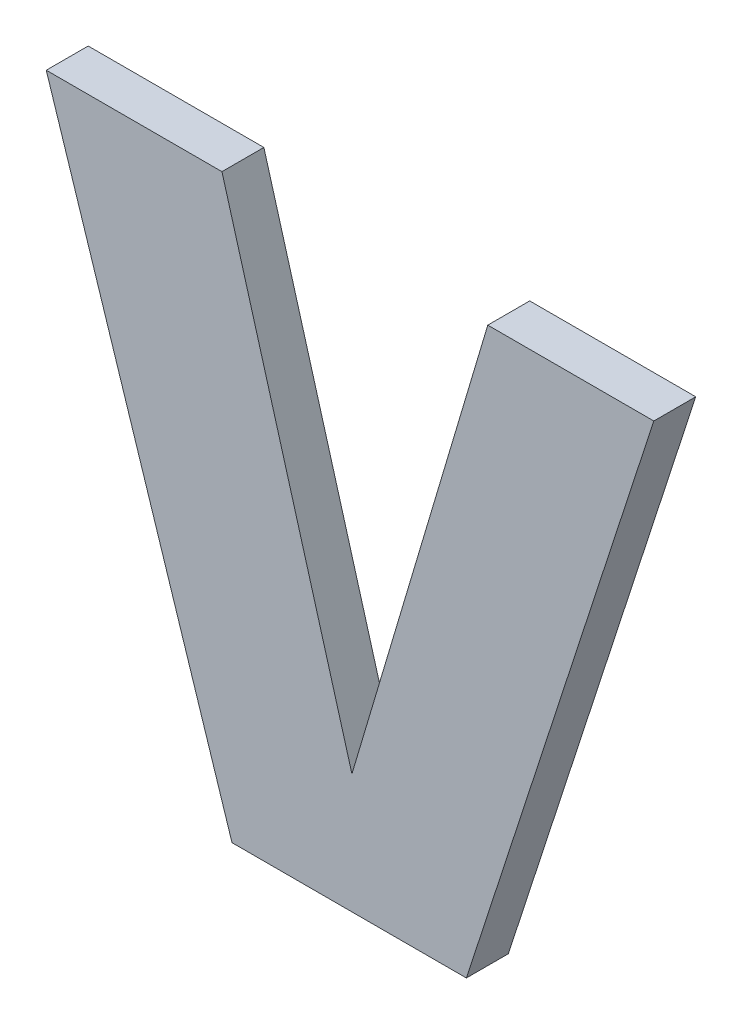
ISO-10303-21;
HEADER;
FILE_DESCRIPTION(('STEP AP214'),'2;1');
FILE_NAME('part.step','',(''),(''),'','','');
FILE_SCHEMA(('AUTOMOTIVE_DESIGN { 1 0 10303 214 1 1 1 1 }'));
ENDSEC;
DATA;
#1=APPLICATION_CONTEXT('core data for automotive mechanical design processes');
#2=APPLICATION_PROTOCOL_DEFINITION('international standard','automotive_design',2000,#1);
#3=PRODUCT_CONTEXT('',#1,'mechanical');
#4=PRODUCT('Part','Part','',(#3));
#5=PRODUCT_RELATED_PRODUCT_CATEGORY('part','',(#4));
#6=PRODUCT_DEFINITION_FORMATION('','',#4);
#7=PRODUCT_DEFINITION_CONTEXT('part definition',#1,'design');
#8=PRODUCT_DEFINITION('design','',#6,#7);
#9=PRODUCT_DEFINITION_SHAPE('','',#8);
#10=(LENGTH_UNIT() NAMED_UNIT(*) SI_UNIT(.MILLI.,.METRE.));
#11=(NAMED_UNIT(*) PLANE_ANGLE_UNIT() SI_UNIT($,.RADIAN.));
#12=(NAMED_UNIT(*) SI_UNIT($,.STERADIAN.) SOLID_ANGLE_UNIT());
#13=UNCERTAINTY_MEASURE_WITH_UNIT(LENGTH_MEASURE(1.E-05),#10,'distance_accuracy_value','');
#14=(GEOMETRIC_REPRESENTATION_CONTEXT(3) GLOBAL_UNCERTAINTY_ASSIGNED_CONTEXT((#13)) GLOBAL_UNIT_ASSIGNED_CONTEXT((#10,
#11,#12)) REPRESENTATION_CONTEXT('',''));
#15=CARTESIAN_POINT('',(0.,0.,0.));
#16=DIRECTION('',(0.,0.,1.));
#17=DIRECTION('',(1.,0.,0.));
#18=AXIS2_PLACEMENT_3D('',#15,#16,#17);
#19=CARTESIAN_POINT('',(0.,0.,0.1));
#20=DIRECTION('',(0.,0.,1.));
#21=DIRECTION('',(1.,0.,0.));
#22=AXIS2_PLACEMENT_3D('',#19,#20,#21);
#23=PLANE('',#22);
#24=DIRECTION('',(-0.273787820309391,0.961790117151467,0.));
#25=VECTOR('',#24,1.);
#26=CARTESIAN_POINT('',(-1.583,-2.527,0.1));
#27=LINE('',#26,#25);
#28=CARTESIAN_POINT('',(-1.89299999999999,-1.438,0.1));
#29=VERTEX_POINT('',#28);
#30=CARTESIAN_POINT('',(-1.58300000000001,-2.527,0.1));
#31=VERTEX_POINT('',#30);
#32=EDGE_CURVE('E88',#29,#31,#27,.F.);
#33=ORIENTED_EDGE('',*,*,#32,.F.);
#34=DIRECTION('',(1.,0.,0.));
#35=VECTOR('',#34,1.);
#36=CARTESIAN_POINT('',(-1.893,-1.438,0.1));
#37=LINE('',#36,#35);
#38=CARTESIAN_POINT('',(-2.312,-1.438,0.1));
#39=VERTEX_POINT('',#38);
#40=EDGE_CURVE('E20',#39,#29,#37,.T.);
#41=ORIENTED_EDGE('',*,*,#40,.F.);
#42=DIRECTION('',(0.306861105029002,-0.951754307697307,0.));
#43=VECTOR('',#42,1.);
#44=CARTESIAN_POINT('',(-2.312,-1.438,0.1));
#45=LINE('',#44,#43);
#46=CARTESIAN_POINT('',(-1.86900000000001,-2.812,0.1));
#47=VERTEX_POINT('',#46);
#48=EDGE_CURVE('E77',#47,#39,#45,.F.);
#49=ORIENTED_EDGE('',*,*,#48,.F.);
#50=DIRECTION('',(1.,0.,0.));
#51=VECTOR('',#50,1.);
#52=CARTESIAN_POINT('',(-1.869,-2.812,0.1));
#53=LINE('',#52,#51);
#54=CARTESIAN_POINT('',(-1.31,-2.812,0.1));
#55=VERTEX_POINT('',#54);
#56=EDGE_CURVE('E72',#55,#47,#53,.F.);
#57=ORIENTED_EDGE('',*,*,#56,.F.);
#58=DIRECTION('',(0.309367749264704,0.950942477605713,0.));
#59=VECTOR('',#58,1.);
#60=CARTESIAN_POINT('',(-1.31,-2.812,0.1));
#61=LINE('',#60,#59);
#62=CARTESIAN_POINT('',(-0.863000000000012,-1.438,0.1));
#63=VERTEX_POINT('',#62);
#64=EDGE_CURVE('E99',#63,#55,#61,.F.);
#65=ORIENTED_EDGE('',*,*,#64,.F.);
#66=DIRECTION('',(1.,0.,0.));
#67=VECTOR('',#66,1.);
#68=CARTESIAN_POINT('',(-0.863,-1.438,0.1));
#69=LINE('',#68,#67);
#70=CARTESIAN_POINT('',(-1.259,-1.438,0.1));
#71=VERTEX_POINT('',#70);
#72=EDGE_CURVE('E103',#71,#63,#69,.T.);
#73=ORIENTED_EDGE('',*,*,#72,.F.);
#74=DIRECTION('',(-0.285166965619702,-0.958477856666106,0.));
#75=VECTOR('',#74,1.);
#76=CARTESIAN_POINT('',(-1.259,-1.438,0.1));
#77=LINE('',#76,#75);
#78=EDGE_CURVE('E107',#31,#71,#77,.F.);
#79=ORIENTED_EDGE('',*,*,#78,.F.);
#80=EDGE_LOOP('',(#33,#41,#49,#57,#65,#73,#79));
#81=FACE_BOUND('',#80,.T.);
#82=ADVANCED_FACE('F17',(#81),#23,.T.);
#83=CARTESIAN_POINT('',(-1.893,-1.438,0.));
#84=DIRECTION('',(0.,1.,0.));
#85=DIRECTION('',(0.,0.,1.));
#86=AXIS2_PLACEMENT_3D('',#83,#84,#85);
#87=PLANE('',#86);
#88=DIRECTION('',(0.,0.,1.));
#89=VECTOR('',#88,1.);
#90=CARTESIAN_POINT('',(-1.89299999999997,-1.43799999999999,0.));
#91=LINE('',#90,#89);
#92=CARTESIAN_POINT('',(-1.89299999999999,-1.438,0.));
#93=VERTEX_POINT('',#92);
#94=EDGE_CURVE('E111',#93,#29,#91,.T.);
#95=ORIENTED_EDGE('',*,*,#94,.F.);
#96=DIRECTION('',(1.,0.,0.));
#97=VECTOR('',#96,1.);
#98=CARTESIAN_POINT('',(0.,-1.438,0.));
#99=LINE('',#98,#97);
#100=CARTESIAN_POINT('',(-2.312,-1.438,0.));
#101=VERTEX_POINT('',#100);
#102=EDGE_CURVE('E94',#93,#101,#99,.F.);
#103=ORIENTED_EDGE('',*,*,#102,.T.);
#104=DIRECTION('',(0.,0.,1.));
#105=VECTOR('',#104,1.);
#106=CARTESIAN_POINT('',(-2.312,-1.438,0.));
#107=LINE('',#106,#105);
#108=EDGE_CURVE('E82',#39,#101,#107,.F.);
#109=ORIENTED_EDGE('',*,*,#108,.F.);
#110=ORIENTED_EDGE('',*,*,#40,.T.);
#111=EDGE_LOOP('',(#95,#103,#109,#110));
#112=FACE_BOUND('',#111,.T.);
#113=ADVANCED_FACE('F93',(#112),#87,.T.);
#114=CARTESIAN_POINT('',(-2.312,-1.438,0.));
#115=DIRECTION('',(-0.951754307697307,-0.306861105029002,0.));
#116=DIRECTION('',(0.306861105029002,-0.951754307697307,0.));
#117=AXIS2_PLACEMENT_3D('',#114,#115,#116);
#118=PLANE('',#117);
#119=ORIENTED_EDGE('',*,*,#108,.T.);
#120=DIRECTION('',(0.30686110502904,-0.951754307697294,0.));
#121=VECTOR('',#120,1.);
#122=CARTESIAN_POINT('',(-2.312,-1.438,0.));
#123=LINE('',#122,#121);
#124=CARTESIAN_POINT('',(-1.86900000000003,-2.81200000000001,0.));
#125=VERTEX_POINT('',#124);
#126=EDGE_CURVE('E116',#101,#125,#123,.T.);
#127=ORIENTED_EDGE('',*,*,#126,.T.);
#128=DIRECTION('',(0.,0.,-1.));
#129=VECTOR('',#128,1.);
#130=CARTESIAN_POINT('',(-1.869,-2.812,0.));
#131=LINE('',#130,#129);
#132=EDGE_CURVE('E84',#47,#125,#131,.T.);
#133=ORIENTED_EDGE('',*,*,#132,.F.);
#134=ORIENTED_EDGE('',*,*,#48,.T.);
#135=EDGE_LOOP('',(#119,#127,#133,#134));
#136=FACE_BOUND('',#135,.T.);
#137=ADVANCED_FACE('F79',(#136),#118,.T.);
#138=CARTESIAN_POINT('',(-1.869,-2.812,0.));
#139=DIRECTION('',(0.,-1.,0.));
#140=DIRECTION('',(0.,0.,-1.));
#141=AXIS2_PLACEMENT_3D('',#138,#139,#140);
#142=PLANE('',#141);
#143=ORIENTED_EDGE('',*,*,#132,.T.);
#144=DIRECTION('',(1.,0.,0.));
#145=VECTOR('',#144,1.);
#146=CARTESIAN_POINT('',(0.,-2.812,0.));
#147=LINE('',#146,#145);
#148=CARTESIAN_POINT('',(-1.31,-2.812,0.));
#149=VERTEX_POINT('',#148);
#150=EDGE_CURVE('E118',#125,#149,#147,.T.);
#151=ORIENTED_EDGE('',*,*,#150,.T.);
#152=DIRECTION('',(0.,0.,1.));
#153=VECTOR('',#152,1.);
#154=CARTESIAN_POINT('',(-1.31,-2.812,0.));
#155=LINE('',#154,#153);
#156=EDGE_CURVE('E101',#55,#149,#155,.F.);
#157=ORIENTED_EDGE('',*,*,#156,.F.);
#158=ORIENTED_EDGE('',*,*,#56,.T.);
#159=EDGE_LOOP('',(#143,#151,#157,#158));
#160=FACE_BOUND('',#159,.T.);
#161=ADVANCED_FACE('F144',(#160),#142,.T.);
#162=CARTESIAN_POINT('',(-1.31,-2.812,0.));
#163=DIRECTION('',(0.950942477605713,-0.309367749264704,0.));
#164=DIRECTION('',(0.309367749264704,0.950942477605713,0.));
#165=AXIS2_PLACEMENT_3D('',#162,#163,#164);
#166=PLANE('',#165);
#167=ORIENTED_EDGE('',*,*,#156,.T.);
#168=DIRECTION('',(0.309367749264737,0.950942477605702,0.));
#169=VECTOR('',#168,1.);
#170=CARTESIAN_POINT('',(-1.31,-2.812,0.));
#171=LINE('',#170,#169);
#172=CARTESIAN_POINT('',(-0.863000000000024,-1.43799999999999,0.));
#173=VERTEX_POINT('',#172);
#174=EDGE_CURVE('E121',#149,#173,#171,.T.);
#175=ORIENTED_EDGE('',*,*,#174,.T.);
#176=DIRECTION('',(0.,0.,1.));
#177=VECTOR('',#176,1.);
#178=CARTESIAN_POINT('',(-0.863,-1.438,0.));
#179=LINE('',#178,#177);
#180=EDGE_CURVE('E105',#63,#173,#179,.F.);
#181=ORIENTED_EDGE('',*,*,#180,.F.);
#182=ORIENTED_EDGE('',*,*,#64,.T.);
#183=EDGE_LOOP('',(#167,#175,#181,#182));
#184=FACE_BOUND('',#183,.T.);
#185=ADVANCED_FACE('F142',(#184),#166,.T.);
#186=CARTESIAN_POINT('',(-0.863,-1.438,0.));
#187=DIRECTION('',(0.,1.,0.));
#188=DIRECTION('',(0.,0.,1.));
#189=AXIS2_PLACEMENT_3D('',#186,#187,#188);
#190=PLANE('',#189);
#191=ORIENTED_EDGE('',*,*,#180,.T.);
#192=DIRECTION('',(1.,0.,0.));
#193=VECTOR('',#192,1.);
#194=CARTESIAN_POINT('',(0.,-1.438,0.));
#195=LINE('',#194,#193);
#196=CARTESIAN_POINT('',(-1.259,-1.438,0.));
#197=VERTEX_POINT('',#196);
#198=EDGE_CURVE('E124',#173,#197,#195,.F.);
#199=ORIENTED_EDGE('',*,*,#198,.T.);
#200=DIRECTION('',(0.,0.,1.));
#201=VECTOR('',#200,1.);
#202=CARTESIAN_POINT('',(-1.259,-1.438,0.));
#203=LINE('',#202,#201);
#204=EDGE_CURVE('E109',#71,#197,#203,.F.);
#205=ORIENTED_EDGE('',*,*,#204,.F.);
#206=ORIENTED_EDGE('',*,*,#72,.T.);
#207=EDGE_LOOP('',(#191,#199,#205,#206));
#208=FACE_BOUND('',#207,.T.);
#209=ADVANCED_FACE('F137',(#208),#190,.T.);
#210=CARTESIAN_POINT('',(-1.259,-1.438,0.));
#211=DIRECTION('',(-0.958477856666106,0.285166965619702,0.));
#212=DIRECTION('',(-0.285166965619702,-0.958477856666106,0.));
#213=AXIS2_PLACEMENT_3D('',#210,#211,#212);
#214=PLANE('',#213);
#215=ORIENTED_EDGE('',*,*,#204,.T.);
#216=DIRECTION('',(-0.285166965619671,-0.958477856666115,0.));
#217=VECTOR('',#216,1.);
#218=CARTESIAN_POINT('',(-1.259,-1.438,0.));
#219=LINE('',#218,#217);
#220=CARTESIAN_POINT('',(-1.58300000000002,-2.527,0.));
#221=VERTEX_POINT('',#220);
#222=EDGE_CURVE('E26',#197,#221,#219,.T.);
#223=ORIENTED_EDGE('',*,*,#222,.T.);
#224=DIRECTION('',(0.,0.,1.));
#225=VECTOR('',#224,1.);
#226=CARTESIAN_POINT('',(-1.583,-2.527,0.));
#227=LINE('',#226,#225);
#228=EDGE_CURVE('E34',#31,#221,#227,.F.);
#229=ORIENTED_EDGE('',*,*,#228,.F.);
#230=ORIENTED_EDGE('',*,*,#78,.T.);
#231=EDGE_LOOP('',(#215,#223,#229,#230));
#232=FACE_BOUND('',#231,.T.);
#233=ADVANCED_FACE('F130',(#232),#214,.T.);
#234=CARTESIAN_POINT('',(-1.583,-2.527,0.));
#235=DIRECTION('',(0.961790117151467,0.273787820309391,0.));
#236=DIRECTION('',(-0.273787820309391,0.961790117151467,0.));
#237=AXIS2_PLACEMENT_3D('',#234,#235,#236);
#238=PLANE('',#237);
#239=ORIENTED_EDGE('',*,*,#228,.T.);
#240=DIRECTION('',(-0.273787820309415,0.96179011715146,0.));
#241=VECTOR('',#240,1.);
#242=CARTESIAN_POINT('',(-1.583,-2.527,0.));
#243=LINE('',#242,#241);
#244=EDGE_CURVE('E11',#221,#93,#243,.T.);
#245=ORIENTED_EDGE('',*,*,#244,.T.);
#246=ORIENTED_EDGE('',*,*,#94,.T.);
#247=ORIENTED_EDGE('',*,*,#32,.T.);
#248=EDGE_LOOP('',(#239,#245,#246,#247));
#249=FACE_BOUND('',#248,.T.);
#250=ADVANCED_FACE('F155',(#249),#238,.T.);
#251=CARTESIAN_POINT('',(0.,0.,0.));
#252=DIRECTION('',(0.,0.,1.));
#253=DIRECTION('',(1.,0.,0.));
#254=AXIS2_PLACEMENT_3D('',#251,#252,#253);
#255=PLANE('',#254);
#256=ORIENTED_EDGE('',*,*,#222,.F.);
#257=ORIENTED_EDGE('',*,*,#198,.F.);
#258=ORIENTED_EDGE('',*,*,#174,.F.);
#259=ORIENTED_EDGE('',*,*,#150,.F.);
#260=ORIENTED_EDGE('',*,*,#126,.F.);
#261=ORIENTED_EDGE('',*,*,#102,.F.);
#262=ORIENTED_EDGE('',*,*,#244,.F.);
#263=EDGE_LOOP('',(#256,#257,#258,#259,#260,#261,#262));
#264=FACE_BOUND('',#263,.T.);
#265=ADVANCED_FACE('F134',(#264),#255,.F.);
#266=CLOSED_SHELL('',(#82,#113,#137,#161,#185,#209,#233,#250,#265));
#267=MANIFOLD_SOLID_BREP('B1',#266);
#268=ADVANCED_BREP_SHAPE_REPRESENTATION('',(#18,#267),#14);
#269=SHAPE_DEFINITION_REPRESENTATION(#9,#268);
ENDSEC;
END-ISO-10303-21;
